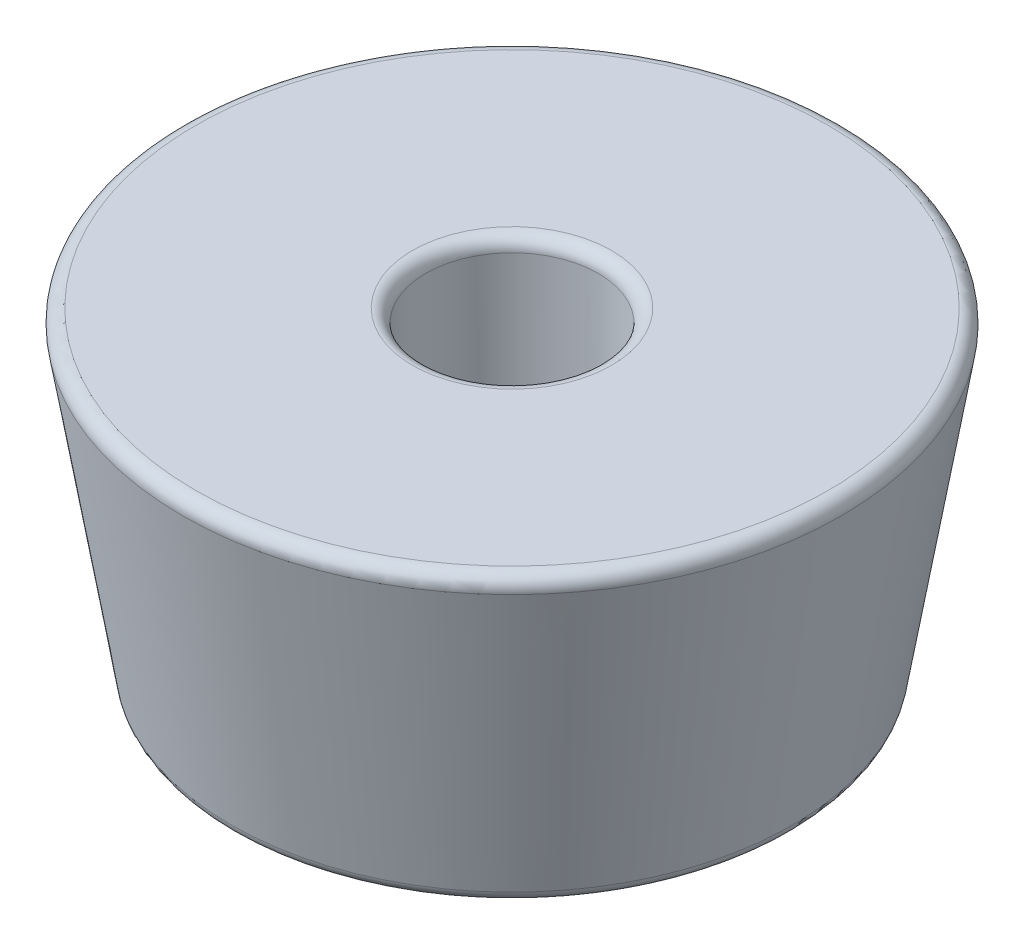
ISO-10303-21;
HEADER;
FILE_DESCRIPTION(('STEP AP214'),'2;1');
FILE_NAME('part.step','',(''),(''),'','','');
FILE_SCHEMA(('AUTOMOTIVE_DESIGN { 1 0 10303 214 1 1 1 1 }'));
ENDSEC;
DATA;
#1=APPLICATION_CONTEXT('core data for automotive mechanical design processes');
#2=APPLICATION_PROTOCOL_DEFINITION('international standard','automotive_design',2000,#1);
#3=PRODUCT_CONTEXT('',#1,'mechanical');
#4=PRODUCT('Part','Part','',(#3));
#5=PRODUCT_RELATED_PRODUCT_CATEGORY('part','',(#4));
#6=PRODUCT_DEFINITION_FORMATION('','',#4);
#7=PRODUCT_DEFINITION_CONTEXT('part definition',#1,'design');
#8=PRODUCT_DEFINITION('design','',#6,#7);
#9=PRODUCT_DEFINITION_SHAPE('','',#8);
#10=(LENGTH_UNIT() NAMED_UNIT(*) SI_UNIT(.MILLI.,.METRE.));
#11=(NAMED_UNIT(*) PLANE_ANGLE_UNIT() SI_UNIT($,.RADIAN.));
#12=(NAMED_UNIT(*) SI_UNIT($,.STERADIAN.) SOLID_ANGLE_UNIT());
#13=UNCERTAINTY_MEASURE_WITH_UNIT(LENGTH_MEASURE(1.E-05),#10,'distance_accuracy_value','');
#14=(GEOMETRIC_REPRESENTATION_CONTEXT(3) GLOBAL_UNCERTAINTY_ASSIGNED_CONTEXT((#13)) GLOBAL_UNIT_ASSIGNED_CONTEXT((#10,
#11,#12)) REPRESENTATION_CONTEXT('',''));
#15=CARTESIAN_POINT('',(0.,0.,0.));
#16=DIRECTION('',(0.,0.,1.));
#17=DIRECTION('',(1.,0.,0.));
#18=AXIS2_PLACEMENT_3D('',#15,#16,#17);
#19=CARTESIAN_POINT('',(0.,0.,0.));
#20=DIRECTION('',(0.,-1.,0.));
#21=DIRECTION('',(0.,0.,-1.));
#22=AXIS2_PLACEMENT_3D('',#19,#20,#21);
#23=PLANE('',#22);
#24=CARTESIAN_POINT('',(0.,0.,0.));
#25=DIRECTION('',(0.,-1.,0.));
#26=DIRECTION('',(0.,0.,-1.));
#27=AXIS2_PLACEMENT_3D('',#24,#25,#26);
#28=CIRCLE('',#27,3.75);
#29=CARTESIAN_POINT('',(0.,0.,-3.75));
#30=VERTEX_POINT('',#29);
#31=EDGE_CURVE('E38',#30,#30,#28,.T.);
#32=ORIENTED_EDGE('',*,*,#31,.T.);
#33=EDGE_LOOP('',(#32));
#34=FACE_BOUND('',#33,.T.);
#35=CARTESIAN_POINT('',(0.,0.,0.));
#36=DIRECTION('',(0.,-1.,0.));
#37=DIRECTION('',(0.,0.,-1.));
#38=AXIS2_PLACEMENT_3D('',#35,#36,#37);
#39=CIRCLE('',#38,11.9097697891418);
#40=CARTESIAN_POINT('',(0.,0.,-11.9097697891418));
#41=VERTEX_POINT('',#40);
#42=EDGE_CURVE('E41',#41,#41,#39,.F.);
#43=ORIENTED_EDGE('',*,*,#42,.T.);
#44=EDGE_LOOP('',(#43));
#45=FACE_BOUND('',#44,.T.);
#46=ADVANCED_FACE('F15',(#34,#45),#23,.F.);
#47=CARTESIAN_POINT('',(0.,0.,0.));
#48=DIRECTION('',(0.,1.,0.));
#49=DIRECTION('',(0.,0.,1.));
#50=AXIS2_PLACEMENT_3D('',#47,#48,#49);
#51=CONICAL_SURFACE('',#50,12.5,0.165148677414626);
#52=CARTESIAN_POINT('',(0.,-11.5821994936527,0.));
#53=DIRECTION('',(0.,-1.,0.));
#54=DIRECTION('',(0.,0.,-1.));
#55=AXIS2_PLACEMENT_3D('',#52,#53,#54);
#56=CIRCLE('',#55,10.5696334177246);
#57=CARTESIAN_POINT('',(0.,-11.5821994936527,-10.5696334177246));
#58=VERTEX_POINT('',#57);
#59=EDGE_CURVE('E10',#58,#58,#56,.F.);
#60=ORIENTED_EDGE('',*,*,#59,.T.);
#61=EDGE_LOOP('',(#60));
#62=FACE_BOUND('',#61,.T.);
#63=CARTESIAN_POINT('',(0.,-0.58219949365268,0.));
#64=DIRECTION('',(0.,-1.,0.));
#65=DIRECTION('',(0.,0.,-1.));
#66=AXIS2_PLACEMENT_3D('',#63,#64,#65);
#67=CIRCLE('',#66,12.4029667510579);
#68=CARTESIAN_POINT('',(0.,-0.58219949365268,-12.4029667510579));
#69=VERTEX_POINT('',#68);
#70=EDGE_CURVE('E22',#69,#69,#67,.T.);
#71=ORIENTED_EDGE('',*,*,#70,.T.);
#72=EDGE_LOOP('',(#71));
#73=FACE_BOUND('',#72,.T.);
#74=ADVANCED_FACE('F73',(#62,#73),#51,.T.);
#75=CARTESIAN_POINT('',(-10.5,-12.,0.));
#76=DIRECTION('',(0.,1.,0.));
#77=DIRECTION('',(0.,0.,1.));
#78=AXIS2_PLACEMENT_3D('',#75,#76,#77);
#79=PLANE('',#78);
#80=CARTESIAN_POINT('',(0.,-12.,0.));
#81=DIRECTION('',(0.,1.,0.));
#82=DIRECTION('',(0.,0.,1.));
#83=AXIS2_PLACEMENT_3D('',#80,#81,#82);
#84=CIRCLE('',#83,6.5);
#85=CARTESIAN_POINT('',(0.,-12.,6.5));
#86=VERTEX_POINT('',#85);
#87=EDGE_CURVE('E30',#86,#86,#84,.T.);
#88=ORIENTED_EDGE('',*,*,#87,.T.);
#89=EDGE_LOOP('',(#88));
#90=FACE_BOUND('',#89,.T.);
#91=CARTESIAN_POINT('',(0.,-12.,0.));
#92=DIRECTION('',(0.,1.,0.));
#93=DIRECTION('',(0.,0.,1.));
#94=AXIS2_PLACEMENT_3D('',#91,#92,#93);
#95=CIRCLE('',#94,10.0764364558085);
#96=CARTESIAN_POINT('',(0.,-12.,10.0764364558085));
#97=VERTEX_POINT('',#96);
#98=EDGE_CURVE('E35',#97,#97,#95,.F.);
#99=ORIENTED_EDGE('',*,*,#98,.T.);
#100=EDGE_LOOP('',(#99));
#101=FACE_BOUND('',#100,.T.);
#102=ADVANCED_FACE('F64',(#90,#101),#79,.F.);
#103=CARTESIAN_POINT('',(0.,-12.,0.));
#104=DIRECTION('',(0.,1.,0.));
#105=DIRECTION('',(0.,0.,1.));
#106=AXIS2_PLACEMENT_3D('',#103,#104,#105);
#107=CYLINDRICAL_SURFACE('',#106,3.25);
#108=CARTESIAN_POINT('',(0.,-0.5,0.));
#109=DIRECTION('',(0.,-1.,0.));
#110=DIRECTION('',(0.,0.,-1.));
#111=AXIS2_PLACEMENT_3D('',#108,#109,#110);
#112=CIRCLE('',#111,3.25);
#113=CARTESIAN_POINT('',(0.,-0.5,-3.25));
#114=VERTEX_POINT('',#113);
#115=EDGE_CURVE('E44',#114,#114,#112,.F.);
#116=ORIENTED_EDGE('',*,*,#115,.T.);
#117=EDGE_LOOP('',(#116));
#118=FACE_BOUND('',#117,.T.);
#119=CARTESIAN_POINT('',(0.,-6.,0.));
#120=DIRECTION('',(0.,1.,0.));
#121=DIRECTION('',(0.,0.,1.));
#122=AXIS2_PLACEMENT_3D('',#119,#120,#121);
#123=CIRCLE('',#122,3.25);
#124=CARTESIAN_POINT('',(0.,-6.,3.25));
#125=VERTEX_POINT('',#124);
#126=EDGE_CURVE('E47',#125,#125,#123,.F.);
#127=ORIENTED_EDGE('',*,*,#126,.T.);
#128=EDGE_LOOP('',(#127));
#129=FACE_BOUND('',#128,.T.);
#130=ADVANCED_FACE('F59',(#118,#129),#107,.F.);
#131=CARTESIAN_POINT('',(0.,-6.,0.));
#132=DIRECTION('',(0.,1.,0.));
#133=DIRECTION('',(0.,0.,1.));
#134=AXIS2_PLACEMENT_3D('',#131,#132,#133);
#135=PLANE('',#134);
#136=CARTESIAN_POINT('',(0.,-6.,0.));
#137=DIRECTION('',(0.,1.,0.));
#138=DIRECTION('',(0.,0.,1.));
#139=AXIS2_PLACEMENT_3D('',#136,#137,#138);
#140=CIRCLE('',#139,6.);
#141=CARTESIAN_POINT('',(0.,-6.,6.));
#142=VERTEX_POINT('',#141);
#143=EDGE_CURVE('E50',#142,#142,#140,.T.);
#144=ORIENTED_EDGE('',*,*,#143,.F.);
#145=EDGE_LOOP('',(#144));
#146=FACE_BOUND('',#145,.T.);
#147=ORIENTED_EDGE('',*,*,#126,.F.);
#148=EDGE_LOOP('',(#147));
#149=FACE_BOUND('',#148,.T.);
#150=ADVANCED_FACE('F56',(#146,#149),#135,.F.);
#151=CARTESIAN_POINT('',(0.,-12.,0.));
#152=DIRECTION('',(0.,1.,0.));
#153=DIRECTION('',(0.,0.,1.));
#154=AXIS2_PLACEMENT_3D('',#151,#152,#153);
#155=CYLINDRICAL_SURFACE('',#154,6.);
#156=CARTESIAN_POINT('',(0.,-11.5,0.));
#157=DIRECTION('',(0.,1.,0.));
#158=DIRECTION('',(0.,0.,1.));
#159=AXIS2_PLACEMENT_3D('',#156,#157,#158);
#160=CIRCLE('',#159,6.);
#161=CARTESIAN_POINT('',(0.,-11.5,6.));
#162=VERTEX_POINT('',#161);
#163=EDGE_CURVE('E26',#162,#162,#160,.F.);
#164=ORIENTED_EDGE('',*,*,#163,.T.);
#165=EDGE_LOOP('',(#164));
#166=FACE_BOUND('',#165,.T.);
#167=ORIENTED_EDGE('',*,*,#143,.T.);
#168=EDGE_LOOP('',(#167));
#169=FACE_BOUND('',#168,.T.);
#170=ADVANCED_FACE('F54',(#166,#169),#155,.F.);
#171=CARTESIAN_POINT('',(0.,-0.5,0.));
#172=DIRECTION('',(0.,-1.,0.));
#173=DIRECTION('',(0.,0.,-1.));
#174=AXIS2_PLACEMENT_3D('',#171,#172,#173);
#175=TOROIDAL_SURFACE('',#174,3.75,0.5);
#176=ORIENTED_EDGE('',*,*,#31,.F.);
#177=EDGE_LOOP('',(#176));
#178=FACE_BOUND('',#177,.T.);
#179=ORIENTED_EDGE('',*,*,#115,.F.);
#180=EDGE_LOOP('',(#179));
#181=FACE_BOUND('',#180,.T.);
#182=ADVANCED_FACE('F87',(#178,#181),#175,.T.);
#183=CARTESIAN_POINT('',(0.,-11.5,0.));
#184=DIRECTION('',(0.,1.,0.));
#185=DIRECTION('',(0.,0.,1.));
#186=AXIS2_PLACEMENT_3D('',#183,#184,#185);
#187=TOROIDAL_SURFACE('',#186,6.5,0.5);
#188=ORIENTED_EDGE('',*,*,#163,.F.);
#189=EDGE_LOOP('',(#188));
#190=FACE_BOUND('',#189,.T.);
#191=ORIENTED_EDGE('',*,*,#87,.F.);
#192=EDGE_LOOP('',(#191));
#193=FACE_BOUND('',#192,.T.);
#194=ADVANCED_FACE('F90',(#190,#193),#187,.T.);
#195=CARTESIAN_POINT('',(0.,-11.5,0.));
#196=DIRECTION('',(0.,1.,0.));
#197=DIRECTION('',(0.,0.,1.));
#198=AXIS2_PLACEMENT_3D('',#195,#196,#197);
#199=TOROIDAL_SURFACE('',#198,10.0764364558085,0.5);
#200=ORIENTED_EDGE('',*,*,#59,.F.);
#201=EDGE_LOOP('',(#200));
#202=FACE_BOUND('',#201,.T.);
#203=ORIENTED_EDGE('',*,*,#98,.F.);
#204=EDGE_LOOP('',(#203));
#205=FACE_BOUND('',#204,.T.);
#206=ADVANCED_FACE('F93',(#202,#205),#199,.T.);
#207=CARTESIAN_POINT('',(0.,-0.5,0.));
#208=DIRECTION('',(0.,-1.,0.));
#209=DIRECTION('',(0.,0.,-1.));
#210=AXIS2_PLACEMENT_3D('',#207,#208,#209);
#211=TOROIDAL_SURFACE('',#210,11.9097697891418,0.5);
#212=ORIENTED_EDGE('',*,*,#42,.F.);
#213=EDGE_LOOP('',(#212));
#214=FACE_BOUND('',#213,.T.);
#215=ORIENTED_EDGE('',*,*,#70,.F.);
#216=EDGE_LOOP('',(#215));
#217=FACE_BOUND('',#216,.T.);
#218=ADVANCED_FACE('F17',(#214,#217),#211,.T.);
#219=CLOSED_SHELL('',(#46,#74,#102,#130,#150,#170,#182,#194,#206,#218));
#220=MANIFOLD_SOLID_BREP('B1',#219);
#221=ADVANCED_BREP_SHAPE_REPRESENTATION('',(#18,#220),#14);
#222=SHAPE_DEFINITION_REPRESENTATION(#9,#221);
ENDSEC;
END-ISO-10303-21;
